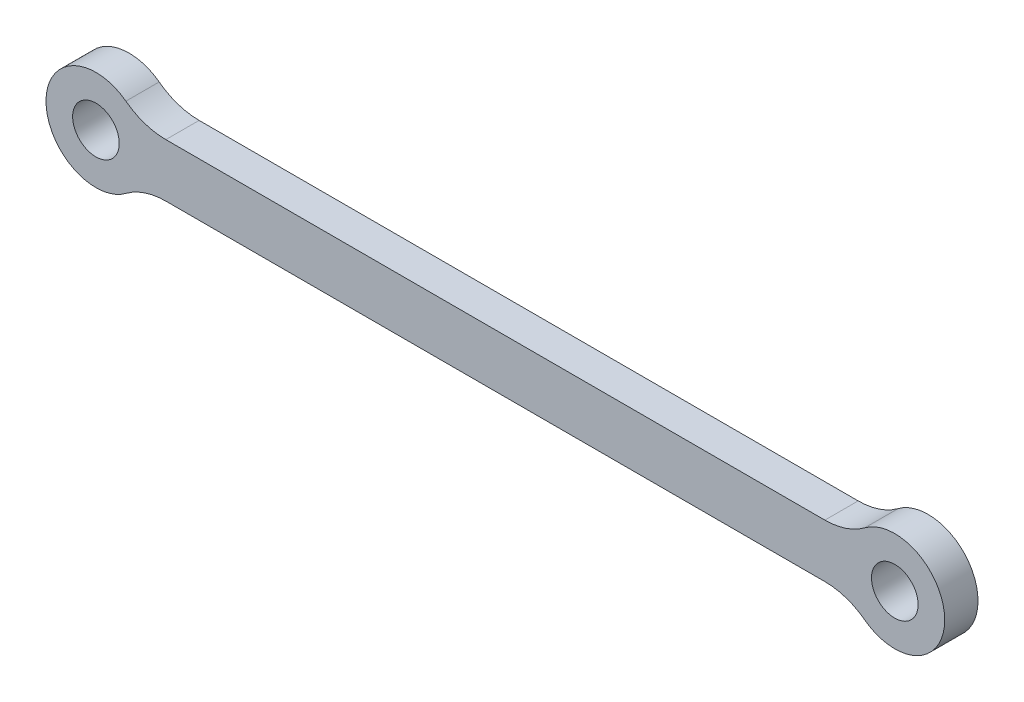
ISO-10303-21;
HEADER;
FILE_DESCRIPTION(('STEP AP214'),'2;1');
FILE_NAME('part.step','',(''),(''),'','','');
FILE_SCHEMA(('AUTOMOTIVE_DESIGN { 1 0 10303 214 1 1 1 1 }'));
ENDSEC;
DATA;
#1=APPLICATION_CONTEXT('core data for automotive mechanical design processes');
#2=APPLICATION_PROTOCOL_DEFINITION('international standard','automotive_design',2000,#1);
#3=PRODUCT_CONTEXT('',#1,'mechanical');
#4=PRODUCT('Part','Part','',(#3));
#5=PRODUCT_RELATED_PRODUCT_CATEGORY('part','',(#4));
#6=PRODUCT_DEFINITION_FORMATION('','',#4);
#7=PRODUCT_DEFINITION_CONTEXT('part definition',#1,'design');
#8=PRODUCT_DEFINITION('design','',#6,#7);
#9=PRODUCT_DEFINITION_SHAPE('','',#8);
#10=(LENGTH_UNIT() NAMED_UNIT(*) SI_UNIT(.MILLI.,.METRE.));
#11=(NAMED_UNIT(*) PLANE_ANGLE_UNIT() SI_UNIT($,.RADIAN.));
#12=(NAMED_UNIT(*) SI_UNIT($,.STERADIAN.) SOLID_ANGLE_UNIT());
#13=UNCERTAINTY_MEASURE_WITH_UNIT(LENGTH_MEASURE(1.E-05),#10,'distance_accuracy_value','');
#14=(GEOMETRIC_REPRESENTATION_CONTEXT(3) GLOBAL_UNCERTAINTY_ASSIGNED_CONTEXT((#13)) GLOBAL_UNIT_ASSIGNED_CONTEXT((#10,
#11,#12)) REPRESENTATION_CONTEXT('',''));
#15=CARTESIAN_POINT('',(0.,0.,0.));
#16=DIRECTION('',(0.,0.,1.));
#17=DIRECTION('',(1.,0.,0.));
#18=AXIS2_PLACEMENT_3D('',#15,#16,#17);
#19=CARTESIAN_POINT('',(-120.,0.,-5.));
#20=DIRECTION('',(0.,0.,1.));
#21=DIRECTION('',(1.,0.,0.));
#22=AXIS2_PLACEMENT_3D('',#19,#20,#21);
#23=CYLINDRICAL_SURFACE('',#22,7.5);
#24=CARTESIAN_POINT('',(-120.,0.,-5.));
#25=DIRECTION('',(0.,0.,1.));
#26=DIRECTION('',(1.,0.,0.));
#27=AXIS2_PLACEMENT_3D('',#24,#25,#26);
#28=CIRCLE('',#27,7.5);
#29=CARTESIAN_POINT('',(-115.5,6.,-5.));
#30=VERTEX_POINT('',#29);
#31=CARTESIAN_POINT('',(-115.5,-6.,-5.));
#32=VERTEX_POINT('',#31);
#33=EDGE_CURVE('E166',#30,#32,#28,.T.);
#34=ORIENTED_EDGE('',*,*,#33,.T.);
#35=DIRECTION('',(0.,0.,1.));
#36=VECTOR('',#35,1.);
#37=CARTESIAN_POINT('',(-115.5,-6.,-5.));
#38=LINE('',#37,#36);
#39=CARTESIAN_POINT('',(-115.5,-6.,0.));
#40=VERTEX_POINT('',#39);
#41=EDGE_CURVE('E145',#32,#40,#38,.T.);
#42=ORIENTED_EDGE('',*,*,#41,.T.);
#43=CARTESIAN_POINT('',(-120.,0.,0.));
#44=DIRECTION('',(0.,0.,1.));
#45=DIRECTION('',(1.,0.,0.));
#46=AXIS2_PLACEMENT_3D('',#43,#44,#45);
#47=CIRCLE('',#46,7.5);
#48=CARTESIAN_POINT('',(-115.5,6.,0.));
#49=VERTEX_POINT('',#48);
#50=EDGE_CURVE('E155',#49,#40,#47,.T.);
#51=ORIENTED_EDGE('',*,*,#50,.F.);
#52=DIRECTION('',(0.,0.,1.));
#53=VECTOR('',#52,1.);
#54=CARTESIAN_POINT('',(-115.5,6.,-5.));
#55=LINE('',#54,#53);
#56=EDGE_CURVE('E57',#49,#30,#55,.F.);
#57=ORIENTED_EDGE('',*,*,#56,.T.);
#58=EDGE_LOOP('',(#34,#42,#51,#57));
#59=FACE_BOUND('',#58,.T.);
#60=ADVANCED_FACE('F35',(#59),#23,.T.);
#61=CARTESIAN_POINT('',(-113.655711229775,4.,-5.));
#62=DIRECTION('',(0.,1.,0.));
#63=DIRECTION('',(-1.,0.,0.));
#64=AXIS2_PLACEMENT_3D('',#61,#62,#63);
#65=PLANE('',#64);
#66=DIRECTION('',(-1.,0.,0.));
#67=VECTOR('',#66,1.);
#68=CARTESIAN_POINT('',(-113.655711229775,4.,0.));
#69=LINE('',#68,#67);
#70=CARTESIAN_POINT('',(-10.5,4.00000000000001,0.));
#71=VERTEX_POINT('',#70);
#72=CARTESIAN_POINT('',(-109.5,4.,0.));
#73=VERTEX_POINT('',#72);
#74=EDGE_CURVE('E123',#71,#73,#69,.T.);
#75=ORIENTED_EDGE('',*,*,#74,.F.);
#76=DIRECTION('',(0.,0.,-1.));
#77=VECTOR('',#76,1.);
#78=CARTESIAN_POINT('',(-10.5,4.00000000000001,-5.));
#79=LINE('',#78,#77);
#80=CARTESIAN_POINT('',(-10.5,4.00000000000001,-5.));
#81=VERTEX_POINT('',#80);
#82=EDGE_CURVE('E138',#71,#81,#79,.T.);
#83=ORIENTED_EDGE('',*,*,#82,.T.);
#84=DIRECTION('',(-1.,0.,0.));
#85=VECTOR('',#84,1.);
#86=CARTESIAN_POINT('',(-113.655711229775,4.,-5.));
#87=LINE('',#86,#85);
#88=CARTESIAN_POINT('',(-109.5,4.,-5.));
#89=VERTEX_POINT('',#88);
#90=EDGE_CURVE('E127',#81,#89,#87,.T.);
#91=ORIENTED_EDGE('',*,*,#90,.T.);
#92=DIRECTION('',(0.,0.,-1.));
#93=VECTOR('',#92,1.);
#94=CARTESIAN_POINT('',(-109.5,4.,0.));
#95=LINE('',#94,#93);
#96=EDGE_CURVE('E129',#89,#73,#95,.F.);
#97=ORIENTED_EDGE('',*,*,#96,.T.);
#98=EDGE_LOOP('',(#75,#83,#91,#97));
#99=FACE_BOUND('',#98,.T.);
#100=ADVANCED_FACE('F168',(#99),#65,.T.);
#101=CARTESIAN_POINT('',(0.,0.,-5.));
#102=DIRECTION('',(0.,0.,1.));
#103=DIRECTION('',(1.,0.,0.));
#104=AXIS2_PLACEMENT_3D('',#101,#102,#103);
#105=CYLINDRICAL_SURFACE('',#104,7.5);
#106=CARTESIAN_POINT('',(0.,0.,-5.));
#107=DIRECTION('',(0.,0.,1.));
#108=DIRECTION('',(1.,0.,0.));
#109=AXIS2_PLACEMENT_3D('',#106,#107,#108);
#110=CIRCLE('',#109,7.5);
#111=CARTESIAN_POINT('',(-4.50000000000001,-6.,-5.));
#112=VERTEX_POINT('',#111);
#113=CARTESIAN_POINT('',(-4.5,6.00000000000001,-5.));
#114=VERTEX_POINT('',#113);
#115=EDGE_CURVE('E132',#112,#114,#110,.T.);
#116=ORIENTED_EDGE('',*,*,#115,.T.);
#117=DIRECTION('',(0.,0.,1.));
#118=VECTOR('',#117,1.);
#119=CARTESIAN_POINT('',(-4.5,6.00000000000001,-5.));
#120=LINE('',#119,#118);
#121=CARTESIAN_POINT('',(-4.5,6.00000000000001,0.));
#122=VERTEX_POINT('',#121);
#123=EDGE_CURVE('E122',#114,#122,#120,.T.);
#124=ORIENTED_EDGE('',*,*,#123,.T.);
#125=CARTESIAN_POINT('',(0.,0.,0.));
#126=DIRECTION('',(0.,0.,1.));
#127=DIRECTION('',(1.,0.,0.));
#128=AXIS2_PLACEMENT_3D('',#125,#126,#127);
#129=CIRCLE('',#128,7.5);
#130=CARTESIAN_POINT('',(-4.50000000000001,-6.,0.));
#131=VERTEX_POINT('',#130);
#132=EDGE_CURVE('E105',#131,#122,#129,.T.);
#133=ORIENTED_EDGE('',*,*,#132,.F.);
#134=DIRECTION('',(0.,0.,1.));
#135=VECTOR('',#134,1.);
#136=CARTESIAN_POINT('',(-4.50000000000001,-6.,-5.));
#137=LINE('',#136,#135);
#138=EDGE_CURVE('E119',#131,#112,#137,.F.);
#139=ORIENTED_EDGE('',*,*,#138,.T.);
#140=EDGE_LOOP('',(#116,#124,#133,#139));
#141=FACE_BOUND('',#140,.T.);
#142=ADVANCED_FACE('F118',(#141),#105,.T.);
#143=CARTESIAN_POINT('',(-113.655711229775,-4.,-5.));
#144=DIRECTION('',(0.,-1.,0.));
#145=DIRECTION('',(1.,0.,0.));
#146=AXIS2_PLACEMENT_3D('',#143,#144,#145);
#147=PLANE('',#146);
#148=DIRECTION('',(1.,0.,0.));
#149=VECTOR('',#148,1.);
#150=CARTESIAN_POINT('',(-113.655711229775,-4.,-5.));
#151=LINE('',#150,#149);
#152=CARTESIAN_POINT('',(-109.5,-4.,-5.));
#153=VERTEX_POINT('',#152);
#154=CARTESIAN_POINT('',(-10.5000000000001,-3.99999999999999,-5.));
#155=VERTEX_POINT('',#154);
#156=EDGE_CURVE('E172',#153,#155,#151,.T.);
#157=ORIENTED_EDGE('',*,*,#156,.T.);
#158=DIRECTION('',(0.,0.,-1.));
#159=VECTOR('',#158,1.);
#160=CARTESIAN_POINT('',(-10.5,-3.99999999999999,0.));
#161=LINE('',#160,#159);
#162=CARTESIAN_POINT('',(-10.5000000000001,-3.99999999999999,0.));
#163=VERTEX_POINT('',#162);
#164=EDGE_CURVE('E142',#155,#163,#161,.F.);
#165=ORIENTED_EDGE('',*,*,#164,.T.);
#166=DIRECTION('',(1.,0.,0.));
#167=VECTOR('',#166,1.);
#168=CARTESIAN_POINT('',(-113.655711229775,-4.,0.));
#169=LINE('',#168,#167);
#170=CARTESIAN_POINT('',(-109.5,-4.,0.));
#171=VERTEX_POINT('',#170);
#172=EDGE_CURVE('E107',#171,#163,#169,.T.);
#173=ORIENTED_EDGE('',*,*,#172,.F.);
#174=DIRECTION('',(0.,0.,-1.));
#175=VECTOR('',#174,1.);
#176=CARTESIAN_POINT('',(-109.5,-4.,-5.));
#177=LINE('',#176,#175);
#178=EDGE_CURVE('E140',#171,#153,#177,.T.);
#179=ORIENTED_EDGE('',*,*,#178,.T.);
#180=EDGE_LOOP('',(#157,#165,#173,#179));
#181=FACE_BOUND('',#180,.T.);
#182=ADVANCED_FACE('F220',(#181),#147,.T.);
#183=CARTESIAN_POINT('',(-120.,0.,-5.));
#184=DIRECTION('',(0.,0.,1.));
#185=DIRECTION('',(1.,0.,0.));
#186=AXIS2_PLACEMENT_3D('',#183,#184,#185);
#187=PLANE('',#186);
#188=CARTESIAN_POINT('',(0.,0.,-5.));
#189=DIRECTION('',(0.,0.,1.));
#190=DIRECTION('',(1.,0.,0.));
#191=AXIS2_PLACEMENT_3D('',#188,#189,#190);
#192=CIRCLE('',#191,3.5);
#193=CARTESIAN_POINT('',(3.5,0.,-5.));
#194=VERTEX_POINT('',#193);
#195=EDGE_CURVE('E182',#194,#194,#192,.T.);
#196=ORIENTED_EDGE('',*,*,#195,.T.);
#197=EDGE_LOOP('',(#196));
#198=FACE_BOUND('',#197,.T.);
#199=CARTESIAN_POINT('',(-120.,0.,-5.));
#200=DIRECTION('',(0.,0.,1.));
#201=DIRECTION('',(1.,0.,0.));
#202=AXIS2_PLACEMENT_3D('',#199,#200,#201);
#203=CIRCLE('',#202,3.50000000000001);
#204=CARTESIAN_POINT('',(-116.5,0.,-5.));
#205=VERTEX_POINT('',#204);
#206=EDGE_CURVE('E160',#205,#205,#203,.T.);
#207=ORIENTED_EDGE('',*,*,#206,.T.);
#208=EDGE_LOOP('',(#207));
#209=FACE_BOUND('',#208,.T.);
#210=ORIENTED_EDGE('',*,*,#33,.F.);
#211=CARTESIAN_POINT('',(-109.5,14.,-5.));
#212=DIRECTION('',(0.,0.,1.));
#213=DIRECTION('',(1.,0.,0.));
#214=AXIS2_PLACEMENT_3D('',#211,#212,#213);
#215=CIRCLE('',#214,10.);
#216=EDGE_CURVE('E11',#30,#89,#215,.T.);
#217=ORIENTED_EDGE('',*,*,#216,.T.);
#218=ORIENTED_EDGE('',*,*,#90,.F.);
#219=CARTESIAN_POINT('',(-10.5,14.,-5.));
#220=DIRECTION('',(0.,0.,1.));
#221=DIRECTION('',(1.,0.,0.));
#222=AXIS2_PLACEMENT_3D('',#219,#220,#221);
#223=CIRCLE('',#222,10.);
#224=EDGE_CURVE('E113',#81,#114,#223,.T.);
#225=ORIENTED_EDGE('',*,*,#224,.T.);
#226=ORIENTED_EDGE('',*,*,#115,.F.);
#227=CARTESIAN_POINT('',(-10.5,-14.,-5.));
#228=DIRECTION('',(0.,0.,1.));
#229=DIRECTION('',(1.,0.,0.));
#230=AXIS2_PLACEMENT_3D('',#227,#228,#229);
#231=CIRCLE('',#230,10.);
#232=EDGE_CURVE('E112',#112,#155,#231,.T.);
#233=ORIENTED_EDGE('',*,*,#232,.T.);
#234=ORIENTED_EDGE('',*,*,#156,.F.);
#235=CARTESIAN_POINT('',(-109.5,-14.,-5.));
#236=DIRECTION('',(0.,0.,1.));
#237=DIRECTION('',(1.,0.,0.));
#238=AXIS2_PLACEMENT_3D('',#235,#236,#237);
#239=CIRCLE('',#238,10.);
#240=EDGE_CURVE('E50',#153,#32,#239,.T.);
#241=ORIENTED_EDGE('',*,*,#240,.T.);
#242=EDGE_LOOP('',(#210,#217,#218,#225,#226,#233,#234,#241));
#243=FACE_BOUND('',#242,.T.);
#244=ADVANCED_FACE('F164',(#198,#209,#243),#187,.F.);
#245=CARTESIAN_POINT('',(-120.,0.,0.));
#246=DIRECTION('',(0.,0.,1.));
#247=DIRECTION('',(1.,0.,0.));
#248=AXIS2_PLACEMENT_3D('',#245,#246,#247);
#249=PLANE('',#248);
#250=CARTESIAN_POINT('',(0.,0.,0.));
#251=DIRECTION('',(0.,0.,1.));
#252=DIRECTION('',(1.,0.,0.));
#253=AXIS2_PLACEMENT_3D('',#250,#251,#252);
#254=CIRCLE('',#253,3.5);
#255=CARTESIAN_POINT('',(3.5,0.,0.));
#256=VERTEX_POINT('',#255);
#257=EDGE_CURVE('E185',#256,#256,#254,.T.);
#258=ORIENTED_EDGE('',*,*,#257,.F.);
#259=EDGE_LOOP('',(#258));
#260=FACE_BOUND('',#259,.T.);
#261=CARTESIAN_POINT('',(-120.,0.,0.));
#262=DIRECTION('',(0.,0.,1.));
#263=DIRECTION('',(1.,0.,0.));
#264=AXIS2_PLACEMENT_3D('',#261,#262,#263);
#265=CIRCLE('',#264,3.50000000000001);
#266=CARTESIAN_POINT('',(-116.5,0.,0.));
#267=VERTEX_POINT('',#266);
#268=EDGE_CURVE('E179',#267,#267,#265,.T.);
#269=ORIENTED_EDGE('',*,*,#268,.F.);
#270=EDGE_LOOP('',(#269));
#271=FACE_BOUND('',#270,.T.);
#272=ORIENTED_EDGE('',*,*,#74,.T.);
#273=CARTESIAN_POINT('',(-109.5,14.,0.));
#274=DIRECTION('',(0.,0.,1.));
#275=DIRECTION('',(1.,0.,0.));
#276=AXIS2_PLACEMENT_3D('',#273,#274,#275);
#277=CIRCLE('',#276,10.);
#278=EDGE_CURVE('E43',#73,#49,#277,.F.);
#279=ORIENTED_EDGE('',*,*,#278,.T.);
#280=ORIENTED_EDGE('',*,*,#50,.T.);
#281=CARTESIAN_POINT('',(-109.5,-14.,0.));
#282=DIRECTION('',(0.,0.,1.));
#283=DIRECTION('',(1.,0.,0.));
#284=AXIS2_PLACEMENT_3D('',#281,#282,#283);
#285=CIRCLE('',#284,10.);
#286=EDGE_CURVE('E152',#40,#171,#285,.F.);
#287=ORIENTED_EDGE('',*,*,#286,.T.);
#288=ORIENTED_EDGE('',*,*,#172,.T.);
#289=CARTESIAN_POINT('',(-10.5,-14.,0.));
#290=DIRECTION('',(0.,0.,1.));
#291=DIRECTION('',(1.,0.,0.));
#292=AXIS2_PLACEMENT_3D('',#289,#290,#291);
#293=CIRCLE('',#292,10.);
#294=EDGE_CURVE('E101',#163,#131,#293,.F.);
#295=ORIENTED_EDGE('',*,*,#294,.T.);
#296=ORIENTED_EDGE('',*,*,#132,.T.);
#297=CARTESIAN_POINT('',(-10.5,14.,0.));
#298=DIRECTION('',(0.,0.,1.));
#299=DIRECTION('',(1.,0.,0.));
#300=AXIS2_PLACEMENT_3D('',#297,#298,#299);
#301=CIRCLE('',#300,10.);
#302=EDGE_CURVE('E148',#122,#71,#301,.F.);
#303=ORIENTED_EDGE('',*,*,#302,.T.);
#304=EDGE_LOOP('',(#272,#279,#280,#287,#288,#295,#296,#303));
#305=FACE_BOUND('',#304,.T.);
#306=ADVANCED_FACE('F104',(#260,#271,#305),#249,.T.);
#307=CARTESIAN_POINT('',(-120.,0.,-5.));
#308=DIRECTION('',(0.,0.,1.));
#309=DIRECTION('',(1.,0.,0.));
#310=AXIS2_PLACEMENT_3D('',#307,#308,#309);
#311=CYLINDRICAL_SURFACE('',#310,3.50000000000001);
#312=ORIENTED_EDGE('',*,*,#206,.F.);
#313=EDGE_LOOP('',(#312));
#314=FACE_BOUND('',#313,.T.);
#315=ORIENTED_EDGE('',*,*,#268,.T.);
#316=EDGE_LOOP('',(#315));
#317=FACE_BOUND('',#316,.T.);
#318=ADVANCED_FACE('F196',(#314,#317),#311,.F.);
#319=CARTESIAN_POINT('',(0.,0.,-5.));
#320=DIRECTION('',(0.,0.,1.));
#321=DIRECTION('',(1.,0.,0.));
#322=AXIS2_PLACEMENT_3D('',#319,#320,#321);
#323=CYLINDRICAL_SURFACE('',#322,3.5);
#324=ORIENTED_EDGE('',*,*,#195,.F.);
#325=EDGE_LOOP('',(#324));
#326=FACE_BOUND('',#325,.T.);
#327=ORIENTED_EDGE('',*,*,#257,.T.);
#328=EDGE_LOOP('',(#327));
#329=FACE_BOUND('',#328,.T.);
#330=ADVANCED_FACE('F193',(#326,#329),#323,.F.);
#331=CARTESIAN_POINT('',(-10.5,14.,-5.));
#332=DIRECTION('',(0.,0.,1.));
#333=DIRECTION('',(1.,0.,0.));
#334=AXIS2_PLACEMENT_3D('',#331,#332,#333);
#335=CYLINDRICAL_SURFACE('',#334,10.);
#336=ORIENTED_EDGE('',*,*,#224,.F.);
#337=ORIENTED_EDGE('',*,*,#82,.F.);
#338=ORIENTED_EDGE('',*,*,#302,.F.);
#339=ORIENTED_EDGE('',*,*,#123,.F.);
#340=EDGE_LOOP('',(#336,#337,#338,#339));
#341=FACE_BOUND('',#340,.T.);
#342=ADVANCED_FACE('F171',(#341),#335,.F.);
#343=CARTESIAN_POINT('',(-10.5,-14.,-5.));
#344=DIRECTION('',(0.,0.,1.));
#345=DIRECTION('',(1.,0.,0.));
#346=AXIS2_PLACEMENT_3D('',#343,#344,#345);
#347=CYLINDRICAL_SURFACE('',#346,10.);
#348=ORIENTED_EDGE('',*,*,#232,.F.);
#349=ORIENTED_EDGE('',*,*,#138,.F.);
#350=ORIENTED_EDGE('',*,*,#294,.F.);
#351=ORIENTED_EDGE('',*,*,#164,.F.);
#352=EDGE_LOOP('',(#348,#349,#350,#351));
#353=FACE_BOUND('',#352,.T.);
#354=ADVANCED_FACE('F126',(#353),#347,.F.);
#355=CARTESIAN_POINT('',(-109.5,-14.,-5.));
#356=DIRECTION('',(0.,0.,1.));
#357=DIRECTION('',(1.,0.,0.));
#358=AXIS2_PLACEMENT_3D('',#355,#356,#357);
#359=CYLINDRICAL_SURFACE('',#358,10.);
#360=ORIENTED_EDGE('',*,*,#240,.F.);
#361=ORIENTED_EDGE('',*,*,#178,.F.);
#362=ORIENTED_EDGE('',*,*,#286,.F.);
#363=ORIENTED_EDGE('',*,*,#41,.F.);
#364=EDGE_LOOP('',(#360,#361,#362,#363));
#365=FACE_BOUND('',#364,.T.);
#366=ADVANCED_FACE('F225',(#365),#359,.F.);
#367=CARTESIAN_POINT('',(-109.5,14.,-5.));
#368=DIRECTION('',(0.,0.,1.));
#369=DIRECTION('',(1.,0.,0.));
#370=AXIS2_PLACEMENT_3D('',#367,#368,#369);
#371=CYLINDRICAL_SURFACE('',#370,10.);
#372=ORIENTED_EDGE('',*,*,#216,.F.);
#373=ORIENTED_EDGE('',*,*,#56,.F.);
#374=ORIENTED_EDGE('',*,*,#278,.F.);
#375=ORIENTED_EDGE('',*,*,#96,.F.);
#376=EDGE_LOOP('',(#372,#373,#374,#375));
#377=FACE_BOUND('',#376,.T.);
#378=ADVANCED_FACE('F37',(#377),#371,.F.);
#379=CLOSED_SHELL('',(#60,#100,#142,#182,#244,#306,#318,#330,#342,#354,#366,#378));
#380=MANIFOLD_SOLID_BREP('B2',#379);
#381=ADVANCED_BREP_SHAPE_REPRESENTATION('',(#18,#380),#14);
#382=SHAPE_DEFINITION_REPRESENTATION(#9,#381);
ENDSEC;
END-ISO-10303-21;
